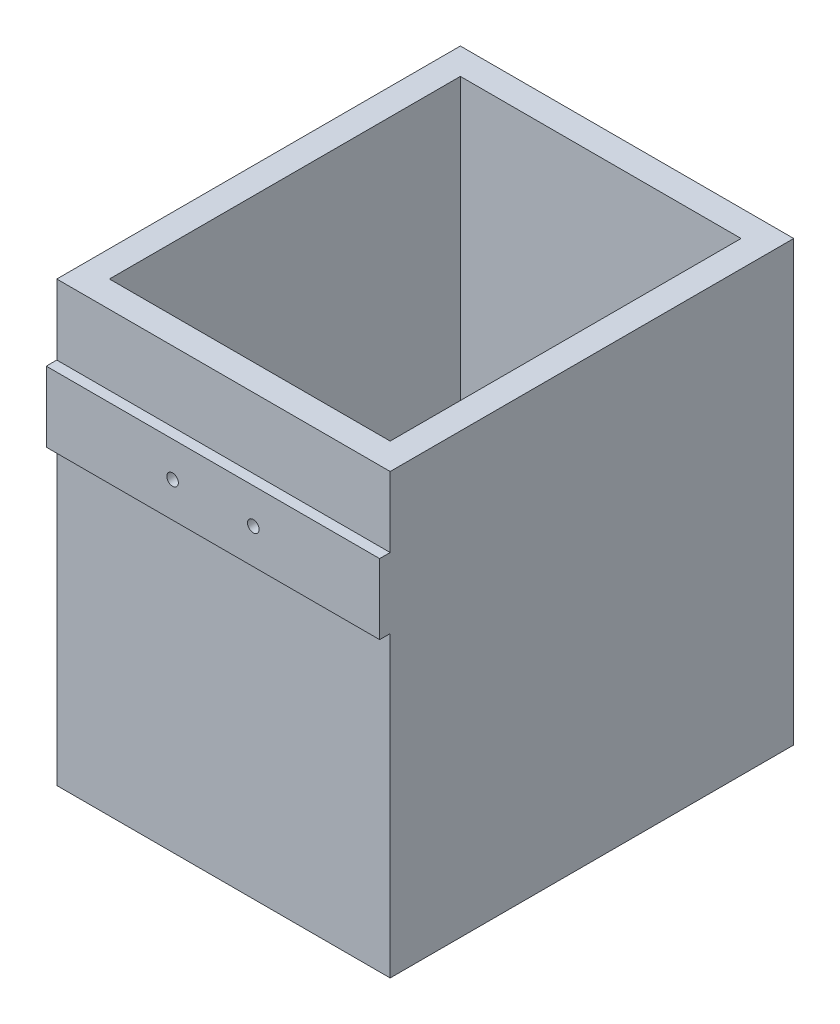
ISO-10303-21;
HEADER;
FILE_DESCRIPTION(('STEP AP214'),'2;1');
FILE_NAME('part.step','',(''),(''),'','','');
FILE_SCHEMA(('AUTOMOTIVE_DESIGN { 1 0 10303 214 1 1 1 1 }'));
ENDSEC;
DATA;
#1=APPLICATION_CONTEXT('core data for automotive mechanical design processes');
#2=APPLICATION_PROTOCOL_DEFINITION('international standard','automotive_design',2000,#1);
#3=PRODUCT_CONTEXT('',#1,'mechanical');
#4=PRODUCT('Part','Part','',(#3));
#5=PRODUCT_RELATED_PRODUCT_CATEGORY('part','',(#4));
#6=PRODUCT_DEFINITION_FORMATION('','',#4);
#7=PRODUCT_DEFINITION_CONTEXT('part definition',#1,'design');
#8=PRODUCT_DEFINITION('design','',#6,#7);
#9=PRODUCT_DEFINITION_SHAPE('','',#8);
#10=(LENGTH_UNIT() NAMED_UNIT(*) SI_UNIT(.MILLI.,.METRE.));
#11=(NAMED_UNIT(*) PLANE_ANGLE_UNIT() SI_UNIT($,.RADIAN.));
#12=(NAMED_UNIT(*) SI_UNIT($,.STERADIAN.) SOLID_ANGLE_UNIT());
#13=UNCERTAINTY_MEASURE_WITH_UNIT(LENGTH_MEASURE(1.E-05),#10,'distance_accuracy_value','');
#14=(GEOMETRIC_REPRESENTATION_CONTEXT(3) GLOBAL_UNCERTAINTY_ASSIGNED_CONTEXT((#13)) GLOBAL_UNIT_ASSIGNED_CONTEXT((#10,
#11,#12)) REPRESENTATION_CONTEXT('',''));
#15=CARTESIAN_POINT('',(0.,0.,0.));
#16=DIRECTION('',(0.,0.,1.));
#17=DIRECTION('',(1.,0.,0.));
#18=AXIS2_PLACEMENT_3D('',#15,#16,#17);
#19=CARTESIAN_POINT('',(11.5,95.,45.3330952441688));
#20=DIRECTION('',(0.,0.,1.));
#21=DIRECTION('',(1.,0.,0.));
#22=AXIS2_PLACEMENT_3D('',#19,#20,#21);
#23=CYLINDRICAL_SURFACE('',#22,1.65);
#24=CARTESIAN_POINT('',(11.5,95.,60.5));
#25=DIRECTION('',(0.,0.,1.));
#26=DIRECTION('',(1.,0.,0.));
#27=AXIS2_PLACEMENT_3D('',#24,#25,#26);
#28=CIRCLE('',#27,1.65);
#29=CARTESIAN_POINT('',(13.15,95.,60.5));
#30=VERTEX_POINT('',#29);
#31=EDGE_CURVE('E282',#30,#30,#28,.T.);
#32=ORIENTED_EDGE('',*,*,#31,.T.);
#33=EDGE_LOOP('',(#32));
#34=FACE_BOUND('',#33,.T.);
#35=CARTESIAN_POINT('',(11.5,95.,53.2));
#36=DIRECTION('',(0.,0.,-1.));
#37=DIRECTION('',(-1.,0.,0.));
#38=AXIS2_PLACEMENT_3D('',#35,#36,#37);
#39=CIRCLE('',#38,1.65);
#40=CARTESIAN_POINT('',(9.85,95.,53.2));
#41=VERTEX_POINT('',#40);
#42=EDGE_CURVE('E43',#41,#41,#39,.F.);
#43=ORIENTED_EDGE('',*,*,#42,.F.);
#44=EDGE_LOOP('',(#43));
#45=FACE_BOUND('',#44,.T.);
#46=ADVANCED_FACE('F39',(#34,#45),#23,.F.);
#47=CARTESIAN_POINT('',(-11.5,95.,45.3330952441688));
#48=DIRECTION('',(0.,0.,1.));
#49=DIRECTION('',(1.,0.,0.));
#50=AXIS2_PLACEMENT_3D('',#47,#48,#49);
#51=CYLINDRICAL_SURFACE('',#50,1.65);
#52=CARTESIAN_POINT('',(-11.5,95.,60.5));
#53=DIRECTION('',(0.,0.,1.));
#54=DIRECTION('',(1.,0.,0.));
#55=AXIS2_PLACEMENT_3D('',#52,#53,#54);
#56=CIRCLE('',#55,1.65);
#57=CARTESIAN_POINT('',(-9.85,95.,60.5));
#58=VERTEX_POINT('',#57);
#59=EDGE_CURVE('E297',#58,#58,#56,.T.);
#60=ORIENTED_EDGE('',*,*,#59,.T.);
#61=EDGE_LOOP('',(#60));
#62=FACE_BOUND('',#61,.T.);
#63=CARTESIAN_POINT('',(-11.5,95.,53.2));
#64=DIRECTION('',(0.,0.,-1.));
#65=DIRECTION('',(-1.,0.,0.));
#66=AXIS2_PLACEMENT_3D('',#63,#64,#65);
#67=CIRCLE('',#66,1.65);
#68=CARTESIAN_POINT('',(-13.15,95.,53.2));
#69=VERTEX_POINT('',#68);
#70=EDGE_CURVE('E276',#69,#69,#67,.F.);
#71=ORIENTED_EDGE('',*,*,#70,.F.);
#72=EDGE_LOOP('',(#71));
#73=FACE_BOUND('',#72,.T.);
#74=ADVANCED_FACE('F339',(#62,#73),#51,.F.);
#75=CARTESIAN_POINT('',(-47.5,125.,57.5));
#76=DIRECTION('',(0.,0.,1.));
#77=DIRECTION('',(1.,0.,0.));
#78=AXIS2_PLACEMENT_3D('',#75,#76,#77);
#79=PLANE('',#78);
#80=DIRECTION('',(-1.,0.,0.));
#81=VECTOR('',#80,1.);
#82=CARTESIAN_POINT('',(-47.5,105.,57.5));
#83=LINE('',#82,#81);
#84=CARTESIAN_POINT('',(47.5,105.,57.5));
#85=VERTEX_POINT('',#84);
#86=CARTESIAN_POINT('',(-47.5,105.,57.5));
#87=VERTEX_POINT('',#86);
#88=EDGE_CURVE('E173',#85,#87,#83,.T.);
#89=ORIENTED_EDGE('',*,*,#88,.F.);
#90=DIRECTION('',(0.,-1.,0.));
#91=VECTOR('',#90,1.);
#92=CARTESIAN_POINT('',(47.5,125.,57.5));
#93=LINE('',#92,#91);
#94=CARTESIAN_POINT('',(47.5,125.,57.5));
#95=VERTEX_POINT('',#94);
#96=EDGE_CURVE('E236',#95,#85,#93,.T.);
#97=ORIENTED_EDGE('',*,*,#96,.F.);
#98=DIRECTION('',(-1.,0.,0.));
#99=VECTOR('',#98,1.);
#100=CARTESIAN_POINT('',(-47.5,125.,57.5));
#101=LINE('',#100,#99);
#102=CARTESIAN_POINT('',(-47.5,125.,57.5));
#103=VERTEX_POINT('',#102);
#104=EDGE_CURVE('E210',#95,#103,#101,.T.);
#105=ORIENTED_EDGE('',*,*,#104,.T.);
#106=DIRECTION('',(0.,-1.,0.));
#107=VECTOR('',#106,1.);
#108=CARTESIAN_POINT('',(-47.5,125.,57.5));
#109=LINE('',#108,#107);
#110=EDGE_CURVE('E64',#103,#87,#109,.T.);
#111=ORIENTED_EDGE('',*,*,#110,.T.);
#112=EDGE_LOOP('',(#89,#97,#105,#111));
#113=FACE_BOUND('',#112,.T.);
#114=ADVANCED_FACE('F316',(#113),#79,.T.);
#115=CARTESIAN_POINT('',(0.,9.,0.));
#116=DIRECTION('',(0.,-1.,0.));
#117=DIRECTION('',(0.,0.,-1.));
#118=AXIS2_PLACEMENT_3D('',#115,#116,#117);
#119=PLANE('',#118);
#120=DIRECTION('',(0.,0.,-1.));
#121=VECTOR('',#120,1.);
#122=CARTESIAN_POINT('',(40.,9.,50.));
#123=LINE('',#122,#121);
#124=CARTESIAN_POINT('',(40.,9.,50.));
#125=VERTEX_POINT('',#124);
#126=CARTESIAN_POINT('',(40.,8.99999999999999,-50.));
#127=VERTEX_POINT('',#126);
#128=EDGE_CURVE('E262',#125,#127,#123,.T.);
#129=ORIENTED_EDGE('',*,*,#128,.T.);
#130=DIRECTION('',(-1.,0.,0.));
#131=VECTOR('',#130,1.);
#132=CARTESIAN_POINT('',(-40.,9.,-50.));
#133=LINE('',#132,#131);
#134=CARTESIAN_POINT('',(-40.,8.99999999999999,-50.));
#135=VERTEX_POINT('',#134);
#136=EDGE_CURVE('E272',#127,#135,#133,.T.);
#137=ORIENTED_EDGE('',*,*,#136,.T.);
#138=DIRECTION('',(0.,0.,1.));
#139=VECTOR('',#138,1.);
#140=CARTESIAN_POINT('',(-40.,9.,50.));
#141=LINE('',#140,#139);
#142=CARTESIAN_POINT('',(-40.,8.99999999999999,50.));
#143=VERTEX_POINT('',#142);
#144=EDGE_CURVE('E48',#135,#143,#141,.T.);
#145=ORIENTED_EDGE('',*,*,#144,.T.);
#146=DIRECTION('',(1.,0.,0.));
#147=VECTOR('',#146,1.);
#148=CARTESIAN_POINT('',(-40.,9.,50.));
#149=LINE('',#148,#147);
#150=EDGE_CURVE('E12',#143,#125,#149,.T.);
#151=ORIENTED_EDGE('',*,*,#150,.T.);
#152=EDGE_LOOP('',(#129,#137,#145,#151));
#153=FACE_BOUND('',#152,.T.);
#154=DIRECTION('',(1.,0.,0.));
#155=VECTOR('',#154,1.);
#156=CARTESIAN_POINT('',(-34.,9.,-42.7));
#157=LINE('',#156,#155);
#158=CARTESIAN_POINT('',(-34.,9.,-42.7));
#159=VERTEX_POINT('',#158);
#160=CARTESIAN_POINT('',(34.,9.,-42.7));
#161=VERTEX_POINT('',#160);
#162=EDGE_CURVE('E250',#159,#161,#157,.T.);
#163=ORIENTED_EDGE('',*,*,#162,.T.);
#164=DIRECTION('',(0.,0.,-1.));
#165=VECTOR('',#164,1.);
#166=CARTESIAN_POINT('',(34.,9.,42.7));
#167=LINE('',#166,#165);
#168=CARTESIAN_POINT('',(34.,9.,42.7));
#169=VERTEX_POINT('',#168);
#170=EDGE_CURVE('E246',#169,#161,#167,.T.);
#171=ORIENTED_EDGE('',*,*,#170,.F.);
#172=DIRECTION('',(1.,0.,0.));
#173=VECTOR('',#172,1.);
#174=CARTESIAN_POINT('',(-34.,9.,42.7));
#175=LINE('',#174,#173);
#176=CARTESIAN_POINT('',(-34.,9.,42.7));
#177=VERTEX_POINT('',#176);
#178=EDGE_CURVE('E242',#177,#169,#175,.T.);
#179=ORIENTED_EDGE('',*,*,#178,.F.);
#180=DIRECTION('',(0.,0.,-1.));
#181=VECTOR('',#180,1.);
#182=CARTESIAN_POINT('',(-34.,9.,42.7));
#183=LINE('',#182,#181);
#184=EDGE_CURVE('E239',#177,#159,#183,.T.);
#185=ORIENTED_EDGE('',*,*,#184,.T.);
#186=EDGE_LOOP('',(#163,#171,#179,#185));
#187=FACE_BOUND('',#186,.T.);
#188=ADVANCED_FACE('F338',(#153,#187),#119,.F.);
#189=CARTESIAN_POINT('',(-34.,-109.165745543188,-42.7));
#190=DIRECTION('',(0.,0.,1.));
#191=DIRECTION('',(1.,0.,0.));
#192=AXIS2_PLACEMENT_3D('',#189,#190,#191);
#193=PLANE('',#192);
#194=DIRECTION('',(1.,0.,0.));
#195=VECTOR('',#194,1.);
#196=CARTESIAN_POINT('',(-34.,2.,-42.7));
#197=LINE('',#196,#195);
#198=CARTESIAN_POINT('',(-34.,2.,-42.7));
#199=VERTEX_POINT('',#198);
#200=CARTESIAN_POINT('',(34.,2.,-42.7));
#201=VERTEX_POINT('',#200);
#202=EDGE_CURVE('E259',#199,#201,#197,.T.);
#203=ORIENTED_EDGE('',*,*,#202,.T.);
#204=DIRECTION('',(0.,1.,0.));
#205=VECTOR('',#204,1.);
#206=CARTESIAN_POINT('',(34.,-109.165745543188,-42.7));
#207=LINE('',#206,#205);
#208=EDGE_CURVE('E257',#201,#161,#207,.T.);
#209=ORIENTED_EDGE('',*,*,#208,.T.);
#210=ORIENTED_EDGE('',*,*,#162,.F.);
#211=DIRECTION('',(0.,1.,0.));
#212=VECTOR('',#211,1.);
#213=CARTESIAN_POINT('',(-34.,-109.165745543188,-42.7));
#214=LINE('',#213,#212);
#215=EDGE_CURVE('E232',#199,#159,#214,.T.);
#216=ORIENTED_EDGE('',*,*,#215,.F.);
#217=EDGE_LOOP('',(#203,#209,#210,#216));
#218=FACE_BOUND('',#217,.T.);
#219=ADVANCED_FACE('F394',(#218),#193,.T.);
#220=CARTESIAN_POINT('',(34.,-109.165745543188,42.7));
#221=DIRECTION('',(1.,0.,0.));
#222=DIRECTION('',(0.,0.,-1.));
#223=AXIS2_PLACEMENT_3D('',#220,#221,#222);
#224=PLANE('',#223);
#225=DIRECTION('',(0.,1.,0.));
#226=VECTOR('',#225,1.);
#227=CARTESIAN_POINT('',(34.,-109.165745543188,42.7));
#228=LINE('',#227,#226);
#229=CARTESIAN_POINT('',(34.,2.,42.7));
#230=VERTEX_POINT('',#229);
#231=EDGE_CURVE('E256',#230,#169,#228,.T.);
#232=ORIENTED_EDGE('',*,*,#231,.T.);
#233=ORIENTED_EDGE('',*,*,#170,.T.);
#234=ORIENTED_EDGE('',*,*,#208,.F.);
#235=DIRECTION('',(0.,0.,-1.));
#236=VECTOR('',#235,1.);
#237=CARTESIAN_POINT('',(34.,2.,42.7));
#238=LINE('',#237,#236);
#239=EDGE_CURVE('E253',#230,#201,#238,.T.);
#240=ORIENTED_EDGE('',*,*,#239,.F.);
#241=EDGE_LOOP('',(#232,#233,#234,#240));
#242=FACE_BOUND('',#241,.T.);
#243=ADVANCED_FACE('F390',(#242),#224,.F.);
#244=CARTESIAN_POINT('',(-34.,-109.165745543188,42.7));
#245=DIRECTION('',(0.,0.,1.));
#246=DIRECTION('',(1.,0.,0.));
#247=AXIS2_PLACEMENT_3D('',#244,#245,#246);
#248=PLANE('',#247);
#249=DIRECTION('',(0.,1.,0.));
#250=VECTOR('',#249,1.);
#251=CARTESIAN_POINT('',(-34.,-109.165745543188,42.7));
#252=LINE('',#251,#250);
#253=CARTESIAN_POINT('',(-34.,2.,42.7));
#254=VERTEX_POINT('',#253);
#255=EDGE_CURVE('E243',#254,#177,#252,.T.);
#256=ORIENTED_EDGE('',*,*,#255,.T.);
#257=ORIENTED_EDGE('',*,*,#178,.T.);
#258=ORIENTED_EDGE('',*,*,#231,.F.);
#259=DIRECTION('',(1.,0.,0.));
#260=VECTOR('',#259,1.);
#261=CARTESIAN_POINT('',(-34.,2.,42.7));
#262=LINE('',#261,#260);
#263=EDGE_CURVE('E254',#254,#230,#262,.T.);
#264=ORIENTED_EDGE('',*,*,#263,.F.);
#265=EDGE_LOOP('',(#256,#257,#258,#264));
#266=FACE_BOUND('',#265,.T.);
#267=ADVANCED_FACE('F386',(#266),#248,.F.);
#268=CARTESIAN_POINT('',(-34.,-109.165745543188,42.7));
#269=DIRECTION('',(1.,0.,0.));
#270=DIRECTION('',(0.,0.,-1.));
#271=AXIS2_PLACEMENT_3D('',#268,#269,#270);
#272=PLANE('',#271);
#273=DIRECTION('',(0.,0.,-1.));
#274=VECTOR('',#273,1.);
#275=CARTESIAN_POINT('',(-34.,2.,42.7));
#276=LINE('',#275,#274);
#277=EDGE_CURVE('E249',#254,#199,#276,.T.);
#278=ORIENTED_EDGE('',*,*,#277,.T.);
#279=ORIENTED_EDGE('',*,*,#215,.T.);
#280=ORIENTED_EDGE('',*,*,#184,.F.);
#281=ORIENTED_EDGE('',*,*,#255,.F.);
#282=EDGE_LOOP('',(#278,#279,#280,#281));
#283=FACE_BOUND('',#282,.T.);
#284=ADVANCED_FACE('F383',(#283),#272,.T.);
#285=CARTESIAN_POINT('',(0.,2.,0.));
#286=DIRECTION('',(0.,-1.,0.));
#287=DIRECTION('',(0.,0.,-1.));
#288=AXIS2_PLACEMENT_3D('',#285,#286,#287);
#289=PLANE('',#288);
#290=ORIENTED_EDGE('',*,*,#277,.F.);
#291=ORIENTED_EDGE('',*,*,#263,.T.);
#292=ORIENTED_EDGE('',*,*,#239,.T.);
#293=ORIENTED_EDGE('',*,*,#202,.F.);
#294=EDGE_LOOP('',(#290,#291,#292,#293));
#295=FACE_BOUND('',#294,.T.);
#296=ADVANCED_FACE('F373',(#295),#289,.F.);
#297=CARTESIAN_POINT('',(40.,125.,-50.));
#298=DIRECTION('',(1.,0.,0.));
#299=DIRECTION('',(0.,0.,-1.));
#300=AXIS2_PLACEMENT_3D('',#297,#298,#299);
#301=PLANE('',#300);
#302=DIRECTION('',(0.,-1.,0.));
#303=VECTOR('',#302,1.);
#304=CARTESIAN_POINT('',(40.,125.,-50.));
#305=LINE('',#304,#303);
#306=CARTESIAN_POINT('',(40.,125.,-50.));
#307=VERTEX_POINT('',#306);
#308=EDGE_CURVE('E196',#307,#127,#305,.T.);
#309=ORIENTED_EDGE('',*,*,#308,.T.);
#310=ORIENTED_EDGE('',*,*,#128,.F.);
#311=DIRECTION('',(0.,-1.,0.));
#312=VECTOR('',#311,1.);
#313=CARTESIAN_POINT('',(40.,125.,50.));
#314=LINE('',#313,#312);
#315=CARTESIAN_POINT('',(40.,125.,50.));
#316=VERTEX_POINT('',#315);
#317=EDGE_CURVE('E195',#316,#125,#314,.T.);
#318=ORIENTED_EDGE('',*,*,#317,.F.);
#319=DIRECTION('',(0.,0.,1.));
#320=VECTOR('',#319,1.);
#321=CARTESIAN_POINT('',(40.,125.,-50.));
#322=LINE('',#321,#320);
#323=EDGE_CURVE('E178',#307,#316,#322,.T.);
#324=ORIENTED_EDGE('',*,*,#323,.F.);
#325=EDGE_LOOP('',(#309,#310,#318,#324));
#326=FACE_BOUND('',#325,.T.);
#327=ADVANCED_FACE('F363',(#326),#301,.F.);
#328=CARTESIAN_POINT('',(-40.,125.,-50.));
#329=DIRECTION('',(0.,0.,-1.));
#330=DIRECTION('',(-1.,0.,0.));
#331=AXIS2_PLACEMENT_3D('',#328,#329,#330);
#332=PLANE('',#331);
#333=DIRECTION('',(0.,-1.,0.));
#334=VECTOR('',#333,1.);
#335=CARTESIAN_POINT('',(-40.,125.,-50.));
#336=LINE('',#335,#334);
#337=CARTESIAN_POINT('',(-40.,125.,-50.));
#338=VERTEX_POINT('',#337);
#339=EDGE_CURVE('E200',#338,#135,#336,.T.);
#340=ORIENTED_EDGE('',*,*,#339,.T.);
#341=ORIENTED_EDGE('',*,*,#136,.F.);
#342=ORIENTED_EDGE('',*,*,#308,.F.);
#343=DIRECTION('',(1.,0.,0.));
#344=VECTOR('',#343,1.);
#345=CARTESIAN_POINT('',(-40.,125.,-50.));
#346=LINE('',#345,#344);
#347=EDGE_CURVE('E192',#338,#307,#346,.T.);
#348=ORIENTED_EDGE('',*,*,#347,.F.);
#349=EDGE_LOOP('',(#340,#341,#342,#348));
#350=FACE_BOUND('',#349,.T.);
#351=ADVANCED_FACE('F359',(#350),#332,.F.);
#352=CARTESIAN_POINT('',(-40.,125.,-50.));
#353=DIRECTION('',(-1.,0.,0.));
#354=DIRECTION('',(0.,0.,1.));
#355=AXIS2_PLACEMENT_3D('',#352,#353,#354);
#356=PLANE('',#355);
#357=DIRECTION('',(0.,-1.,0.));
#358=VECTOR('',#357,1.);
#359=CARTESIAN_POINT('',(-40.,125.,50.));
#360=LINE('',#359,#358);
#361=CARTESIAN_POINT('',(-40.,125.,50.));
#362=VERTEX_POINT('',#361);
#363=EDGE_CURVE('E203',#362,#143,#360,.T.);
#364=ORIENTED_EDGE('',*,*,#363,.T.);
#365=ORIENTED_EDGE('',*,*,#144,.F.);
#366=ORIENTED_EDGE('',*,*,#339,.F.);
#367=DIRECTION('',(0.,0.,-1.));
#368=VECTOR('',#367,1.);
#369=CARTESIAN_POINT('',(-40.,125.,-50.));
#370=LINE('',#369,#368);
#371=EDGE_CURVE('E189',#362,#338,#370,.T.);
#372=ORIENTED_EDGE('',*,*,#371,.F.);
#373=EDGE_LOOP('',(#364,#365,#366,#372));
#374=FACE_BOUND('',#373,.T.);
#375=ADVANCED_FACE('F362',(#374),#356,.F.);
#376=CARTESIAN_POINT('',(-40.,125.,50.));
#377=DIRECTION('',(0.,0.,1.));
#378=DIRECTION('',(1.,0.,0.));
#379=AXIS2_PLACEMENT_3D('',#376,#377,#378);
#380=PLANE('',#379);
#381=CARTESIAN_POINT('',(11.5,95.,50.));
#382=DIRECTION('',(0.,0.,-1.));
#383=DIRECTION('',(-1.,0.,0.));
#384=AXIS2_PLACEMENT_3D('',#381,#382,#383);
#385=CIRCLE('',#384,3.);
#386=CARTESIAN_POINT('',(8.5,95.,50.));
#387=VERTEX_POINT('',#386);
#388=EDGE_CURVE('E284',#387,#387,#385,.T.);
#389=ORIENTED_EDGE('',*,*,#388,.F.);
#390=EDGE_LOOP('',(#389));
#391=FACE_BOUND('',#390,.T.);
#392=CARTESIAN_POINT('',(-11.5,95.,50.));
#393=DIRECTION('',(0.,0.,-1.));
#394=DIRECTION('',(-1.,0.,0.));
#395=AXIS2_PLACEMENT_3D('',#392,#393,#394);
#396=CIRCLE('',#395,3.);
#397=CARTESIAN_POINT('',(-14.5,95.,50.));
#398=VERTEX_POINT('',#397);
#399=EDGE_CURVE('E294',#398,#398,#396,.T.);
#400=ORIENTED_EDGE('',*,*,#399,.F.);
#401=EDGE_LOOP('',(#400));
#402=FACE_BOUND('',#401,.T.);
#403=ORIENTED_EDGE('',*,*,#317,.T.);
#404=ORIENTED_EDGE('',*,*,#150,.F.);
#405=ORIENTED_EDGE('',*,*,#363,.F.);
#406=DIRECTION('',(-1.,0.,0.));
#407=VECTOR('',#406,1.);
#408=CARTESIAN_POINT('',(-40.,125.,50.));
#409=LINE('',#408,#407);
#410=EDGE_CURVE('E181',#316,#362,#409,.T.);
#411=ORIENTED_EDGE('',*,*,#410,.F.);
#412=EDGE_LOOP('',(#403,#404,#405,#411));
#413=FACE_BOUND('',#412,.T.);
#414=ADVANCED_FACE('F367',(#391,#402,#413),#380,.F.);
#415=CARTESIAN_POINT('',(47.5,125.,-57.5));
#416=DIRECTION('',(1.,0.,0.));
#417=DIRECTION('',(0.,0.,-1.));
#418=AXIS2_PLACEMENT_3D('',#415,#416,#417);
#419=PLANE('',#418);
#420=DIRECTION('',(0.,0.,1.));
#421=VECTOR('',#420,1.);
#422=CARTESIAN_POINT('',(47.5,0.,-57.5));
#423=LINE('',#422,#421);
#424=CARTESIAN_POINT('',(47.5,0.,-57.5));
#425=VERTEX_POINT('',#424);
#426=CARTESIAN_POINT('',(47.5,0.,57.5));
#427=VERTEX_POINT('',#426);
#428=EDGE_CURVE('E199',#425,#427,#423,.T.);
#429=ORIENTED_EDGE('',*,*,#428,.F.);
#430=DIRECTION('',(0.,-1.,0.));
#431=VECTOR('',#430,1.);
#432=CARTESIAN_POINT('',(47.5,125.,-57.5));
#433=LINE('',#432,#431);
#434=CARTESIAN_POINT('',(47.5,125.,-57.5));
#435=VERTEX_POINT('',#434);
#436=EDGE_CURVE('E230',#435,#425,#433,.T.);
#437=ORIENTED_EDGE('',*,*,#436,.F.);
#438=DIRECTION('',(0.,0.,1.));
#439=VECTOR('',#438,1.);
#440=CARTESIAN_POINT('',(47.5,125.,-57.5));
#441=LINE('',#440,#439);
#442=EDGE_CURVE('E207',#435,#95,#441,.T.);
#443=ORIENTED_EDGE('',*,*,#442,.T.);
#444=ORIENTED_EDGE('',*,*,#96,.T.);
#445=DIRECTION('',(0.,0.,-1.));
#446=VECTOR('',#445,1.);
#447=CARTESIAN_POINT('',(47.5,105.,60.5));
#448=LINE('',#447,#446);
#449=CARTESIAN_POINT('',(47.5,105.,60.5));
#450=VERTEX_POINT('',#449);
#451=EDGE_CURVE('E183',#450,#85,#448,.T.);
#452=ORIENTED_EDGE('',*,*,#451,.F.);
#453=DIRECTION('',(0.,1.,0.));
#454=VECTOR('',#453,1.);
#455=CARTESIAN_POINT('',(47.5,105.,60.5));
#456=LINE('',#455,#454);
#457=CARTESIAN_POINT('',(47.5,85.,60.5));
#458=VERTEX_POINT('',#457);
#459=EDGE_CURVE('E163',#458,#450,#456,.T.);
#460=ORIENTED_EDGE('',*,*,#459,.F.);
#461=DIRECTION('',(0.,0.,-1.));
#462=VECTOR('',#461,1.);
#463=CARTESIAN_POINT('',(47.5,85.,60.5));
#464=LINE('',#463,#462);
#465=CARTESIAN_POINT('',(47.5,85.,57.5));
#466=VERTEX_POINT('',#465);
#467=EDGE_CURVE('E160',#458,#466,#464,.T.);
#468=ORIENTED_EDGE('',*,*,#467,.T.);
#469=EDGE_CURVE('E219',#466,#427,#93,.T.);
#470=ORIENTED_EDGE('',*,*,#469,.T.);
#471=EDGE_LOOP('',(#429,#437,#443,#444,#452,#460,#468,#470));
#472=FACE_BOUND('',#471,.T.);
#473=ADVANCED_FACE('F313',(#472),#419,.T.);
#474=CARTESIAN_POINT('',(-47.5,125.,-57.5));
#475=DIRECTION('',(0.,0.,-1.));
#476=DIRECTION('',(-1.,0.,0.));
#477=AXIS2_PLACEMENT_3D('',#474,#475,#476);
#478=PLANE('',#477);
#479=DIRECTION('',(1.,0.,0.));
#480=VECTOR('',#479,1.);
#481=CARTESIAN_POINT('',(-47.5,0.,-57.5));
#482=LINE('',#481,#480);
#483=CARTESIAN_POINT('',(-47.5,0.,-57.5));
#484=VERTEX_POINT('',#483);
#485=EDGE_CURVE('E211',#484,#425,#482,.T.);
#486=ORIENTED_EDGE('',*,*,#485,.F.);
#487=DIRECTION('',(0.,-1.,0.));
#488=VECTOR('',#487,1.);
#489=CARTESIAN_POINT('',(-47.5,125.,-57.5));
#490=LINE('',#489,#488);
#491=CARTESIAN_POINT('',(-47.5,125.,-57.5));
#492=VERTEX_POINT('',#491);
#493=EDGE_CURVE('E233',#492,#484,#490,.T.);
#494=ORIENTED_EDGE('',*,*,#493,.F.);
#495=DIRECTION('',(1.,0.,0.));
#496=VECTOR('',#495,1.);
#497=CARTESIAN_POINT('',(-47.5,125.,-57.5));
#498=LINE('',#497,#496);
#499=EDGE_CURVE('E216',#492,#435,#498,.T.);
#500=ORIENTED_EDGE('',*,*,#499,.T.);
#501=ORIENTED_EDGE('',*,*,#436,.T.);
#502=EDGE_LOOP('',(#486,#494,#500,#501));
#503=FACE_BOUND('',#502,.T.);
#504=ADVANCED_FACE('F325',(#503),#478,.T.);
#505=CARTESIAN_POINT('',(-47.5,125.,-57.5));
#506=DIRECTION('',(-1.,0.,0.));
#507=DIRECTION('',(0.,0.,1.));
#508=AXIS2_PLACEMENT_3D('',#505,#506,#507);
#509=PLANE('',#508);
#510=DIRECTION('',(0.,0.,-1.));
#511=VECTOR('',#510,1.);
#512=CARTESIAN_POINT('',(-47.5,0.,-57.5));
#513=LINE('',#512,#511);
#514=CARTESIAN_POINT('',(-47.5,0.,57.5));
#515=VERTEX_POINT('',#514);
#516=EDGE_CURVE('E225',#515,#484,#513,.T.);
#517=ORIENTED_EDGE('',*,*,#516,.F.);
#518=CARTESIAN_POINT('',(-47.5,85.,57.5));
#519=VERTEX_POINT('',#518);
#520=EDGE_CURVE('E177',#519,#515,#109,.T.);
#521=ORIENTED_EDGE('',*,*,#520,.F.);
#522=DIRECTION('',(0.,0.,-1.));
#523=VECTOR('',#522,1.);
#524=CARTESIAN_POINT('',(-47.5,85.,60.5));
#525=LINE('',#524,#523);
#526=CARTESIAN_POINT('',(-47.5,85.,60.5));
#527=VERTEX_POINT('',#526);
#528=EDGE_CURVE('E158',#527,#519,#525,.T.);
#529=ORIENTED_EDGE('',*,*,#528,.F.);
#530=DIRECTION('',(0.,-1.,0.));
#531=VECTOR('',#530,1.);
#532=CARTESIAN_POINT('',(-47.5,105.,60.5));
#533=LINE('',#532,#531);
#534=CARTESIAN_POINT('',(-47.5,105.,60.5));
#535=VERTEX_POINT('',#534);
#536=EDGE_CURVE('E164',#535,#527,#533,.T.);
#537=ORIENTED_EDGE('',*,*,#536,.F.);
#538=DIRECTION('',(0.,0.,-1.));
#539=VECTOR('',#538,1.);
#540=CARTESIAN_POINT('',(-47.5,105.,60.5));
#541=LINE('',#540,#539);
#542=EDGE_CURVE('E304',#535,#87,#541,.T.);
#543=ORIENTED_EDGE('',*,*,#542,.T.);
#544=ORIENTED_EDGE('',*,*,#110,.F.);
#545=DIRECTION('',(0.,0.,-1.));
#546=VECTOR('',#545,1.);
#547=CARTESIAN_POINT('',(-47.5,125.,-57.5));
#548=LINE('',#547,#546);
#549=EDGE_CURVE('E213',#103,#492,#548,.T.);
#550=ORIENTED_EDGE('',*,*,#549,.T.);
#551=ORIENTED_EDGE('',*,*,#493,.T.);
#552=EDGE_LOOP('',(#517,#521,#529,#537,#543,#544,#550,#551));
#553=FACE_BOUND('',#552,.T.);
#554=ADVANCED_FACE('F176',(#553),#509,.T.);
#555=DIRECTION('',(1.,0.,0.));
#556=VECTOR('',#555,1.);
#557=CARTESIAN_POINT('',(-47.5,85.,57.5));
#558=LINE('',#557,#556);
#559=EDGE_CURVE('E56',#519,#466,#558,.T.);
#560=ORIENTED_EDGE('',*,*,#559,.F.);
#561=ORIENTED_EDGE('',*,*,#520,.T.);
#562=DIRECTION('',(-1.,0.,0.));
#563=VECTOR('',#562,1.);
#564=CARTESIAN_POINT('',(-47.5,0.,57.5));
#565=LINE('',#564,#563);
#566=EDGE_CURVE('E222',#427,#515,#565,.T.);
#567=ORIENTED_EDGE('',*,*,#566,.F.);
#568=ORIENTED_EDGE('',*,*,#469,.F.);
#569=EDGE_LOOP('',(#560,#561,#567,#568));
#570=FACE_BOUND('',#569,.T.);
#571=ADVANCED_FACE('F326',(#570),#79,.T.);
#572=CARTESIAN_POINT('',(0.,125.,0.));
#573=DIRECTION('',(0.,1.,0.));
#574=DIRECTION('',(0.,0.,1.));
#575=AXIS2_PLACEMENT_3D('',#572,#573,#574);
#576=PLANE('',#575);
#577=ORIENTED_EDGE('',*,*,#323,.T.);
#578=ORIENTED_EDGE('',*,*,#410,.T.);
#579=ORIENTED_EDGE('',*,*,#371,.T.);
#580=ORIENTED_EDGE('',*,*,#347,.T.);
#581=EDGE_LOOP('',(#577,#578,#579,#580));
#582=FACE_BOUND('',#581,.T.);
#583=ORIENTED_EDGE('',*,*,#442,.F.);
#584=ORIENTED_EDGE('',*,*,#499,.F.);
#585=ORIENTED_EDGE('',*,*,#549,.F.);
#586=ORIENTED_EDGE('',*,*,#104,.F.);
#587=EDGE_LOOP('',(#583,#584,#585,#586));
#588=FACE_BOUND('',#587,.T.);
#589=ADVANCED_FACE('F319',(#582,#588),#576,.T.);
#590=CARTESIAN_POINT('',(0.,0.,0.));
#591=DIRECTION('',(0.,-1.,0.));
#592=DIRECTION('',(0.,0.,-1.));
#593=AXIS2_PLACEMENT_3D('',#590,#591,#592);
#594=PLANE('',#593);
#595=ORIENTED_EDGE('',*,*,#428,.T.);
#596=ORIENTED_EDGE('',*,*,#566,.T.);
#597=ORIENTED_EDGE('',*,*,#516,.T.);
#598=ORIENTED_EDGE('',*,*,#485,.T.);
#599=EDGE_LOOP('',(#595,#596,#597,#598));
#600=FACE_BOUND('',#599,.T.);
#601=ADVANCED_FACE('F41',(#600),#594,.T.);
#602=CARTESIAN_POINT('',(-47.5,85.,60.5));
#603=DIRECTION('',(0.,1.,0.));
#604=DIRECTION('',(0.,0.,1.));
#605=AXIS2_PLACEMENT_3D('',#602,#603,#604);
#606=PLANE('',#605);
#607=ORIENTED_EDGE('',*,*,#559,.T.);
#608=ORIENTED_EDGE('',*,*,#467,.F.);
#609=DIRECTION('',(1.,0.,0.));
#610=VECTOR('',#609,1.);
#611=CARTESIAN_POINT('',(-47.5,85.,60.5));
#612=LINE('',#611,#610);
#613=EDGE_CURVE('E154',#527,#458,#612,.T.);
#614=ORIENTED_EDGE('',*,*,#613,.F.);
#615=ORIENTED_EDGE('',*,*,#528,.T.);
#616=EDGE_LOOP('',(#607,#608,#614,#615));
#617=FACE_BOUND('',#616,.T.);
#618=ADVANCED_FACE('F156',(#617),#606,.F.);
#619=CARTESIAN_POINT('',(-47.5,105.,60.5));
#620=DIRECTION('',(0.,-1.,0.));
#621=DIRECTION('',(0.,0.,-1.));
#622=AXIS2_PLACEMENT_3D('',#619,#620,#621);
#623=PLANE('',#622);
#624=ORIENTED_EDGE('',*,*,#88,.T.);
#625=ORIENTED_EDGE('',*,*,#542,.F.);
#626=DIRECTION('',(-1.,0.,0.));
#627=VECTOR('',#626,1.);
#628=CARTESIAN_POINT('',(-47.5,105.,60.5));
#629=LINE('',#628,#627);
#630=EDGE_CURVE('E169',#450,#535,#629,.T.);
#631=ORIENTED_EDGE('',*,*,#630,.F.);
#632=ORIENTED_EDGE('',*,*,#451,.T.);
#633=EDGE_LOOP('',(#624,#625,#631,#632));
#634=FACE_BOUND('',#633,.T.);
#635=ADVANCED_FACE('F310',(#634),#623,.F.);
#636=CARTESIAN_POINT('',(0.,0.,60.5));
#637=DIRECTION('',(0.,0.,1.));
#638=DIRECTION('',(1.,0.,0.));
#639=AXIS2_PLACEMENT_3D('',#636,#637,#638);
#640=PLANE('',#639);
#641=ORIENTED_EDGE('',*,*,#59,.F.);
#642=EDGE_LOOP('',(#641));
#643=FACE_BOUND('',#642,.T.);
#644=ORIENTED_EDGE('',*,*,#31,.F.);
#645=EDGE_LOOP('',(#644));
#646=FACE_BOUND('',#645,.T.);
#647=ORIENTED_EDGE('',*,*,#536,.T.);
#648=ORIENTED_EDGE('',*,*,#613,.T.);
#649=ORIENTED_EDGE('',*,*,#459,.T.);
#650=ORIENTED_EDGE('',*,*,#630,.T.);
#651=EDGE_LOOP('',(#647,#648,#649,#650));
#652=FACE_BOUND('',#651,.T.);
#653=ADVANCED_FACE('F167',(#643,#646,#652),#640,.T.);
#654=CARTESIAN_POINT('',(-11.5,95.,53.2));
#655=DIRECTION('',(0.,0.,-1.));
#656=DIRECTION('',(-1.,0.,0.));
#657=AXIS2_PLACEMENT_3D('',#654,#655,#656);
#658=PLANE('',#657);
#659=CARTESIAN_POINT('',(-11.5,95.,53.2));
#660=DIRECTION('',(0.,0.,-1.));
#661=DIRECTION('',(-1.,0.,0.));
#662=AXIS2_PLACEMENT_3D('',#659,#660,#661);
#663=CIRCLE('',#662,3.);
#664=CARTESIAN_POINT('',(-14.5,95.,53.2));
#665=VERTEX_POINT('',#664);
#666=EDGE_CURVE('E289',#665,#665,#663,.T.);
#667=ORIENTED_EDGE('',*,*,#666,.T.);
#668=EDGE_LOOP('',(#667));
#669=FACE_BOUND('',#668,.T.);
#670=ORIENTED_EDGE('',*,*,#70,.T.);
#671=EDGE_LOOP('',(#670));
#672=FACE_BOUND('',#671,.T.);
#673=ADVANCED_FACE('F353',(#669,#672),#658,.T.);
#674=CARTESIAN_POINT('',(-11.5,95.,53.2));
#675=DIRECTION('',(0.,0.,-1.));
#676=DIRECTION('',(-1.,0.,0.));
#677=AXIS2_PLACEMENT_3D('',#674,#675,#676);
#678=CYLINDRICAL_SURFACE('',#677,3.);
#679=ORIENTED_EDGE('',*,*,#666,.F.);
#680=EDGE_LOOP('',(#679));
#681=FACE_BOUND('',#680,.T.);
#682=ORIENTED_EDGE('',*,*,#399,.T.);
#683=EDGE_LOOP('',(#682));
#684=FACE_BOUND('',#683,.T.);
#685=ADVANCED_FACE('F472',(#681,#684),#678,.F.);
#686=CARTESIAN_POINT('',(11.5,95.,53.2));
#687=DIRECTION('',(0.,0.,-1.));
#688=DIRECTION('',(-1.,0.,0.));
#689=AXIS2_PLACEMENT_3D('',#686,#687,#688);
#690=PLANE('',#689);
#691=CARTESIAN_POINT('',(11.5,95.,53.2));
#692=DIRECTION('',(0.,0.,-1.));
#693=DIRECTION('',(-1.,0.,0.));
#694=AXIS2_PLACEMENT_3D('',#691,#692,#693);
#695=CIRCLE('',#694,3.);
#696=CARTESIAN_POINT('',(8.5,95.,53.2));
#697=VERTEX_POINT('',#696);
#698=EDGE_CURVE('E278',#697,#697,#695,.T.);
#699=ORIENTED_EDGE('',*,*,#698,.T.);
#700=EDGE_LOOP('',(#699));
#701=FACE_BOUND('',#700,.T.);
#702=ORIENTED_EDGE('',*,*,#42,.T.);
#703=EDGE_LOOP('',(#702));
#704=FACE_BOUND('',#703,.T.);
#705=ADVANCED_FACE('F483',(#701,#704),#690,.T.);
#706=CARTESIAN_POINT('',(11.5,95.,53.2));
#707=DIRECTION('',(0.,0.,-1.));
#708=DIRECTION('',(-1.,0.,0.));
#709=AXIS2_PLACEMENT_3D('',#706,#707,#708);
#710=CYLINDRICAL_SURFACE('',#709,3.);
#711=ORIENTED_EDGE('',*,*,#698,.F.);
#712=EDGE_LOOP('',(#711));
#713=FACE_BOUND('',#712,.T.);
#714=ORIENTED_EDGE('',*,*,#388,.T.);
#715=EDGE_LOOP('',(#714));
#716=FACE_BOUND('',#715,.T.);
#717=ADVANCED_FACE('F492',(#713,#716),#710,.F.);
#718=CLOSED_SHELL('',(#46,#74,#114,#188,#219,#243,#267,#284,#296,#327,#351,#375,#414,#473,#504,
#554,#571,#589,#601,#618,#635,#653,#673,#685,#705,#717));
#719=MANIFOLD_SOLID_BREP('B2',#718);
#720=ADVANCED_BREP_SHAPE_REPRESENTATION('',(#18,#719),#14);
#721=SHAPE_DEFINITION_REPRESENTATION(#9,#720);
ENDSEC;
END-ISO-10303-21;
